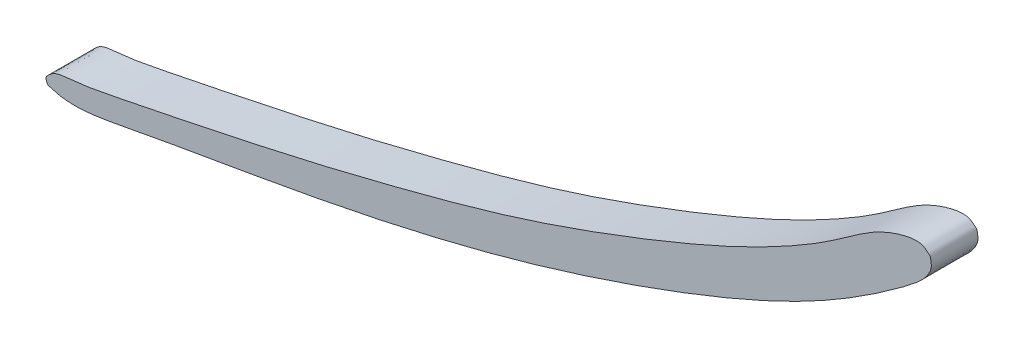
ISO-10303-21;
HEADER;
FILE_DESCRIPTION(('STEP AP214'),'2;1');
FILE_NAME('part.step','',(''),(''),'','','');
FILE_SCHEMA(('AUTOMOTIVE_DESIGN { 1 0 10303 214 1 1 1 1 }'));
ENDSEC;
DATA;
#1=APPLICATION_CONTEXT('core data for automotive mechanical design processes');
#2=APPLICATION_PROTOCOL_DEFINITION('international standard','automotive_design',2000,#1);
#3=PRODUCT_CONTEXT('',#1,'mechanical');
#4=PRODUCT('Part','Part','',(#3));
#5=PRODUCT_RELATED_PRODUCT_CATEGORY('part','',(#4));
#6=PRODUCT_DEFINITION_FORMATION('','',#4);
#7=PRODUCT_DEFINITION_CONTEXT('part definition',#1,'design');
#8=PRODUCT_DEFINITION('design','',#6,#7);
#9=PRODUCT_DEFINITION_SHAPE('','',#8);
#10=(LENGTH_UNIT() NAMED_UNIT(*) SI_UNIT(.MILLI.,.METRE.));
#11=(NAMED_UNIT(*) PLANE_ANGLE_UNIT() SI_UNIT($,.RADIAN.));
#12=(NAMED_UNIT(*) SI_UNIT($,.STERADIAN.) SOLID_ANGLE_UNIT());
#13=UNCERTAINTY_MEASURE_WITH_UNIT(LENGTH_MEASURE(1.E-05),#10,'distance_accuracy_value','');
#14=(GEOMETRIC_REPRESENTATION_CONTEXT(3) GLOBAL_UNCERTAINTY_ASSIGNED_CONTEXT((#13)) GLOBAL_UNIT_ASSIGNED_CONTEXT((#10,
#11,#12)) REPRESENTATION_CONTEXT('',''));
#15=CARTESIAN_POINT('',(0.,0.,0.));
#16=DIRECTION('',(0.,0.,1.));
#17=DIRECTION('',(1.,0.,0.));
#18=AXIS2_PLACEMENT_3D('',#15,#16,#17);
#19=CARTESIAN_POINT('',(90.3893181570191,0.,268.));
#20=CARTESIAN_POINT('',(90.3449741612423,0.095532494994125,268.));
#21=CARTESIAN_POINT('',(90.1903564309577,0.245790694884648,268.));
#22=CARTESIAN_POINT('',(89.9405943360615,0.435941672784849,268.));
#23=CARTESIAN_POINT('',(89.6951845925782,0.636693972334386,268.));
#24=CARTESIAN_POINT('',(89.4387216703739,0.820644299010657,268.));
#25=CARTESIAN_POINT('',(89.1649470762525,0.980294080954537,268.));
#26=CARTESIAN_POINT('',(88.7667192173757,1.12420436102548,268.));
#27=CARTESIAN_POINT('',(88.2408347863377,1.18949627413386,268.));
#28=CARTESIAN_POINT('',(87.608723644344,1.1691062138102,268.));
#29=CARTESIAN_POINT('',(86.9802003671491,1.09886794531898,268.));
#30=CARTESIAN_POINT('',(86.3586755890797,0.983353035462187,268.));
#31=CARTESIAN_POINT('',(85.7437171456279,0.837587611066315,268.));
#32=CARTESIAN_POINT('',(85.1343664404484,0.670082959282239,268.));
#33=CARTESIAN_POINT('',(84.5311174702158,0.481803882794702,268.));
#34=CARTESIAN_POINT('',(83.9340956746508,0.274754548220123,268.));
#35=CARTESIAN_POINT('',(83.3433244025098,0.0504855144417144,268.));
#36=CARTESIAN_POINT('',(82.7594200995892,-0.191027916262883,268.));
#37=CARTESIAN_POINT('',(82.1827365135072,-0.449332646868724,268.));
#38=CARTESIAN_POINT('',(81.614200324908,-0.725062440023513,268.));
#39=CARTESIAN_POINT('',(80.8672787095549,-1.11480141244054,268.));
#40=CARTESIAN_POINT('',(79.9549830951592,-1.64128467244249,268.));
#41=CARTESIAN_POINT('',(78.8879080755908,-2.31822422684007,268.));
#42=CARTESIAN_POINT('',(77.8414912402726,-3.02649318941564,268.));
#43=CARTESIAN_POINT('',(76.8077567521688,-3.75289115159552,268.));
#44=CARTESIAN_POINT('',(75.7786136453781,-4.48575219300204,268.));
#45=CARTESIAN_POINT('',(74.745192620238,-5.21243120349757,268.));
#46=CARTESIAN_POINT('',(73.705363162358,-5.92998691769541,268.));
#47=CARTESIAN_POINT('',(72.3071430189177,-6.869245398545,268.));
#48=CARTESIAN_POINT('',(70.5312108287513,-8.00056772699131,268.));
#49=CARTESIAN_POINT('',(68.3631687300206,-9.29785458309508,268.));
#50=CARTESIAN_POINT('',(66.1666638112714,-10.5459677731653,268.));
#51=CARTESIAN_POINT('',(63.9470326874852,-11.7521462886571,268.));
#52=CARTESIAN_POINT('',(61.7082450789077,-12.9221109172396,268.));
#53=CARTESIAN_POINT('',(59.4497540113533,-14.0533743082484,268.));
#54=CARTESIAN_POINT('',(57.1732117093506,-15.147555923275,268.));
#55=CARTESIAN_POINT('',(54.8811676784019,-16.2086355588447,268.));
#56=CARTESIAN_POINT('',(52.5758379654934,-17.2402602053796,268.));
#57=CARTESIAN_POINT('',(50.2595268678546,-18.2467700903842,268.));
#58=CARTESIAN_POINT('',(47.9340234121225,-19.23161731736,268.));
#59=CARTESIAN_POINT('',(44.8222672242958,-20.5180467173457,268.));
#60=CARTESIAN_POINT('',(40.9139844588329,-22.0801142270649,268.));
#61=CARTESIAN_POINT('',(36.1984889440622,-23.8886972769083,268.));
#62=CARTESIAN_POINT('',(31.4600336591885,-25.6357826754557,268.));
#63=CARTESIAN_POINT('',(26.6971577675447,-27.3149660429353,268.));
#64=CARTESIAN_POINT('',(21.9067452305384,-28.9138699408159,268.));
#65=CARTESIAN_POINT('',(17.0879242461507,-30.4250208800967,268.));
#66=CARTESIAN_POINT('',(12.2433592867536,-31.8514680641838,268.));
#67=CARTESIAN_POINT('',(7.37851377490247,-33.2072266679951,268.));
#68=CARTESIAN_POINT('',(2.49889883570663,-34.5091828654854,268.));
#69=CARTESIAN_POINT('',(-2.39099235554833,-35.7726575653205,268.));
#70=CARTESIAN_POINT('',(-7.28941613787878,-37.0036330418181,268.));
#71=CARTESIAN_POINT('',(-12.196990588602,-38.1988440077258,268.));
#72=CARTESIAN_POINT('',(-17.1142137640381,-39.3552737952703,268.));
#73=CARTESIAN_POINT('',(-21.2207022343462,-40.2821809608322,268.));
#74=CARTESIAN_POINT('',(-24.5099849549281,-41.0062434060181,268.));
#75=CARTESIAN_POINT('',(-26.9788682738963,-41.5410374274786,268.));
#76=CARTESIAN_POINT('',(-29.4495481771915,-42.068057471845,268.));
#77=CARTESIAN_POINT('',(-31.9218989186076,-42.5877976930578,268.));
#78=CARTESIAN_POINT('',(-34.3952599370916,-43.1033632188692,268.));
#79=CARTESIAN_POINT('',(-36.8693617728037,-43.6160571894405,268.));
#80=CARTESIAN_POINT('',(-39.3442472179342,-44.1256799714126,268.));
#81=CARTESIAN_POINT('',(-41.819883606697,-44.632401539919,268.));
#82=CARTESIAN_POINT('',(-43.8831470797298,-45.0541977878998,268.));
#83=CARTESIAN_POINT('',(-45.5341384085799,-45.3901912193429,268.));
#84=CARTESIAN_POINT('',(-46.7727250147161,-45.6407041525217,268.));
#85=CARTESIAN_POINT('',(-48.0118074805438,-45.8889748995857,268.));
#86=CARTESIAN_POINT('',(-49.2512985743143,-46.1354178627128,268.));
#87=CARTESIAN_POINT('',(-50.4911599153867,-46.3802183105027,268.));
#88=CARTESIAN_POINT('',(-51.5246083062557,-46.5832572123511,268.));
#89=CARTESIAN_POINT('',(-52.3527437588727,-46.7386938665083,268.));
#90=CARTESIAN_POINT('',(-52.9747852677357,-46.8501732803603,268.));
#91=CARTESIAN_POINT('',(-53.5980180999265,-46.9549541682327,268.));
#92=CARTESIAN_POINT('',(-54.2226088994548,-47.0513396700387,268.));
#93=CARTESIAN_POINT('',(-54.8485352623323,-47.1388193099239,268.));
#94=CARTESIAN_POINT('',(-55.4757624991505,-47.216410098303,268.));
#95=CARTESIAN_POINT('',(-56.1041759315506,-47.2841002560838,268.));
#96=CARTESIAN_POINT('',(-56.7337834105256,-47.3393740035283,268.));
#97=CARTESIAN_POINT('',(-57.3636077486203,-47.3923177682917,268.));
#98=CARTESIAN_POINT('',(-57.9921371875076,-47.459535681437,268.));
#99=CARTESIAN_POINT('',(-58.617459931412,-47.5531750411075,268.));
#100=CARTESIAN_POINT('',(-59.1323214178197,-47.6665361646427,268.));
#101=CARTESIAN_POINT('',(-59.533911254146,-47.7959840558897,268.));
#102=CARTESIAN_POINT('',(-59.8259782101639,-47.9170972552867,268.));
#103=CARTESIAN_POINT('',(-60.1049439929597,-48.0668856428846,268.));
#104=CARTESIAN_POINT('',(-60.364306841939,-48.2484398600975,268.));
#105=CARTESIAN_POINT('',(-60.6080319935694,-48.4493493412946,268.));
#106=CARTESIAN_POINT('',(-60.8377098136074,-48.6678246256958,268.));
#107=CARTESIAN_POINT('',(-61.0636551247925,-48.8862166783374,268.));
#108=CARTESIAN_POINT('',(-61.1938215215347,-49.0584119130356,268.));
#109=CARTESIAN_POINT('',(-61.2419943616398,-49.2207126076058,268.));
#110=CARTESIAN_POINT('',(-61.2507595327435,-49.3504814375911,268.));
#111=CARTESIAN_POINT('',(-61.2144418375225,-49.539132710305,268.));
#112=CARTESIAN_POINT('',(-61.1598348326393,-49.7234082321822,268.));
#113=CARTESIAN_POINT('',(-61.093082378302,-49.9030009171411,268.));
#114=CARTESIAN_POINT('',(-60.999537939376,-50.0725001877869,268.));
#115=CARTESIAN_POINT('',(-60.8547836775959,-50.2035916471443,268.));
#116=CARTESIAN_POINT('',(-60.6721638964919,-50.2704189447769,268.));
#117=CARTESIAN_POINT('',(-60.4856304793058,-50.3120302155312,268.));
#118=CARTESIAN_POINT('',(-60.2979803225231,-50.3535951936377,268.));
#119=CARTESIAN_POINT('',(-60.0504246501731,-50.4174788984263,268.));
#120=CARTESIAN_POINT('',(-59.742620398469,-50.50440759381,268.));
#121=CARTESIAN_POINT('',(-59.3739519165278,-50.6106906092224,268.));
#122=CARTESIAN_POINT('',(-59.0010570021076,-50.7018436693387,268.));
#123=CARTESIAN_POINT('',(-58.6237267382278,-50.7722969621957,268.));
#124=CARTESIAN_POINT('',(-58.243835610727,-50.8269085471101,268.));
#125=CARTESIAN_POINT('',(-57.862187922574,-50.867596039482,268.));
#126=CARTESIAN_POINT('',(-57.4795543729846,-50.8972190040287,268.));
#127=CARTESIAN_POINT('',(-57.096336551515,-50.9181761426262,268.));
#128=CARTESIAN_POINT('',(-56.7127721849629,-50.9313493555014,268.));
#129=CARTESIAN_POINT('',(-56.329005568683,-50.936708477107,268.));
#130=CARTESIAN_POINT('',(-55.9452032521428,-50.9345749716004,268.));
#131=CARTESIAN_POINT('',(-55.5615018146098,-50.9251844563151,268.));
#132=CARTESIAN_POINT('',(-55.0501976145661,-50.9033474618915,268.));
#133=CARTESIAN_POINT('',(-54.4119316042755,-50.8592575920939,268.));
#134=CARTESIAN_POINT('',(-53.6478860849468,-50.7839610419192,268.));
#135=CARTESIAN_POINT('',(-52.8858249955221,-50.6906495298872,268.));
#136=CARTESIAN_POINT('',(-52.1255119002948,-50.5839156868908,268.));
#137=CARTESIAN_POINT('',(-51.366652995808,-50.4671311707637,268.));
#138=CARTESIAN_POINT('',(-50.6091057440555,-50.3419420460893,268.));
#139=CARTESIAN_POINT('',(-49.8526064019016,-50.2104127241271,268.));
#140=CARTESIAN_POINT('',(-49.0968565454264,-50.0744791199165,268.));
#141=CARTESIAN_POINT('',(-48.3415544064759,-49.9359082440822,268.));
#142=CARTESIAN_POINT('',(-47.5866088853657,-49.795248544097,268.));
#143=CARTESIAN_POINT('',(-46.580290112188,-49.6060059394261,268.));
#144=CARTESIAN_POINT('',(-45.3225323070613,-49.3683134768694,268.));
#145=CARTESIAN_POINT('',(-43.8125243053064,-49.0861706501287,268.));
#146=CARTESIAN_POINT('',(-42.301823868569,-48.8071462831319,268.));
#147=CARTESIAN_POINT('',(-40.7902307810726,-48.5323853469724,268.));
#148=CARTESIAN_POINT('',(-39.2778166321588,-48.2615919187462,268.));
#149=CARTESIAN_POINT('',(-37.2603213364181,-47.9050626472468,268.));
#150=CARTESIAN_POINT('',(-34.7371202014104,-47.4656077685439,268.));
#151=CARTESIAN_POINT('',(-31.7079197640359,-46.9440036546648,268.));
#152=CARTESIAN_POINT('',(-28.6784720531132,-46.4219232720013,268.));
#153=CARTESIAN_POINT('',(-25.6494973233373,-45.8953769148422,268.));
#154=CARTESIAN_POINT('',(-22.6217158175266,-45.3603748919555,268.));
#155=CARTESIAN_POINT('',(-19.5956835026523,-44.8142599576629,268.));
#156=CARTESIAN_POINT('',(-16.5719563452682,-44.2543748696664,268.));
#157=CARTESIAN_POINT('',(-13.5509097085504,-43.6792524857762,268.));
#158=CARTESIAN_POINT('',(-10.532918955579,-43.0874256652819,268.));
#159=CARTESIAN_POINT('',(-7.51839583441635,-42.477613769529,268.));
#160=CARTESIAN_POINT('',(-4.50775209670752,-41.8485361225504,268.));
#161=CARTESIAN_POINT('',(-0.499182991426727,-40.9829292380272,268.));
#162=CARTESIAN_POINT('',(4.50014230220984,-39.8484474034174,268.));
#163=CARTESIAN_POINT('',(10.477026578799,-38.3929130562989,268.));
#164=CARTESIAN_POINT('',(16.4289741195897,-36.8397102025609,268.));
#165=CARTESIAN_POINT('',(22.3507608035447,-35.1772364412315,268.));
#166=CARTESIAN_POINT('',(28.2391377720439,-33.4032291656442,268.));
#167=CARTESIAN_POINT('',(32.1414874516204,-32.1481538009184,268.));
#168=CARTESIAN_POINT('',(35.3987413368636,-31.0678022392212,268.));
#169=CARTESIAN_POINT('',(38.017927450495,-30.1813347872321,268.));
#170=CARTESIAN_POINT('',(41.9311881759202,-28.804490310831,268.));
#171=CARTESIAN_POINT('',(45.8281291609075,-27.3806880848635,268.));
#172=CARTESIAN_POINT('',(49.7067679246719,-25.9067881785557,268.));
#173=CARTESIAN_POINT('',(53.5643763836165,-24.3781816480184,268.));
#174=CARTESIAN_POINT('',(57.3970870456508,-22.7880545039109,268.));
#175=CARTESIAN_POINT('',(60.5649097963154,-21.4018484692677,268.));
#176=CARTESIAN_POINT('',(63.0794912722467,-20.2495825487365,268.));
#177=CARTESIAN_POINT('',(64.9543810042245,-19.3619043433722,268.));
#178=CARTESIAN_POINT('',(66.8169734365983,-18.4489392965895,268.));
#179=CARTESIAN_POINT('',(68.6658338917919,-17.5087734734508,268.));
#180=CARTESIAN_POINT('',(70.4998111704287,-16.5402080970252,268.));
#181=CARTESIAN_POINT('',(72.3175653947791,-15.5418947666822,268.));
#182=CARTESIAN_POINT('',(74.1180835249587,-14.5131992295929,268.));
#183=CARTESIAN_POINT('',(75.9001740822143,-13.4533274672683,268.));
#184=CARTESIAN_POINT('',(77.6634132661252,-12.3628212679054,268.));
#185=CARTESIAN_POINT('',(79.4075681502796,-11.242552586073,268.));
#186=CARTESIAN_POINT('',(81.1330236381052,-10.0941748282077,268.));
#187=CARTESIAN_POINT('',(82.5549812862226,-9.11415311622516,268.));
#188=CARTESIAN_POINT('',(83.6846454660794,-8.31912075198982,268.));
#189=CARTESIAN_POINT('',(84.5275984895049,-7.71693063197795,268.));
#190=CARTESIAN_POINT('',(85.3659122571856,-7.10841631339921,268.));
#191=CARTESIAN_POINT('',(86.1975610533912,-6.49099736125044,268.));
#192=CARTESIAN_POINT('',(86.8833589252887,-5.96690992426684,268.));
#193=CARTESIAN_POINT('',(87.4231988901658,-5.53645658358077,268.));
#194=CARTESIAN_POINT('',(87.8226020860301,-5.20692267937711,268.));
#195=CARTESIAN_POINT('',(88.2154508983264,-4.86959267857574,268.));
#196=CARTESIAN_POINT('',(88.5990685104187,-4.52179847260577,268.));
#197=CARTESIAN_POINT('',(88.9693287926501,-4.15978528562518,268.));
#198=CARTESIAN_POINT('',(89.3221666694029,-3.78068714941963,268.));
#199=CARTESIAN_POINT('',(89.6523799938622,-3.38171222628572,268.));
#200=CARTESIAN_POINT('',(89.9523557935328,-2.95919081488107,268.));
#201=CARTESIAN_POINT('',(90.212333730247,-2.51102429841182,268.));
#202=CARTESIAN_POINT('',(90.4272426878479,-2.03912829809428,268.));
#203=CARTESIAN_POINT('',(90.5442947457863,-1.62203694399719,268.));
#204=CARTESIAN_POINT('',(90.577661025838,-1.27743731600624,268.));
#205=CARTESIAN_POINT('',(90.5613932390312,-1.01851585251253,268.));
#206=CARTESIAN_POINT('',(90.5210852184666,-0.763126986990301,268.));
#207=CARTESIAN_POINT('',(90.4741935099733,-0.507955367680359,268.));
#208=CARTESIAN_POINT('',(90.4493178854206,-0.251456427520445,268.));
#209=CARTESIAN_POINT('',(90.4256325875517,-0.0782339997173593,268.));
#210=CARTESIAN_POINT('',(90.3893181570191,0.,268.));
#211=B_SPLINE_CURVE_WITH_KNOTS('',3,(#19,#20,#21,#22,#23,#24,#25,#26,#27,#28,#29,#30,#31,#32,
#33,#34,#35,#36,#37,#38,#39,#40,#41,#42,#43,#44,#45,#46,#47,#48,#49,#50,#51,#52,#53,#54,#55,#56,
#57,#58,#59,#60,#61,#62,#63,#64,#65,#66,#67,#68,#69,#70,#71,#72,#73,#74,#75,#76,#77,#78,#79,#80,
#81,#82,#83,#84,#85,#86,#87,#88,#89,#90,#91,#92,#93,#94,#95,#96,#97,#98,#99,#100,#101,#102,#103,
#104,#105,#106,#107,#108,#109,#110,#111,#112,#113,#114,#115,#116,#117,#118,#119,#120,#121,#122,
#123,#124,#125,#126,#127,#128,#129,#130,#131,#132,#133,#134,#135,#136,#137,#138,#139,#140,#141,
#142,#143,#144,#145,#146,#147,#148,#149,#150,#151,#152,#153,#154,#155,#156,#157,#158,#159,#160,
#161,#162,#163,#164,#165,#166,#167,#168,#169,#170,#171,#172,#173,#174,#175,#176,#177,#178,#179,
#180,#181,#182,#183,#184,#185,#186,#187,#188,#189,#190,#191,#192,#193,#194,#195,#196,#197,#198,
#199,#200,#201,#202,#203,#204,#205,#206,#207,#208,#209,#210),.UNSPECIFIED.,.T.,.F.,(4,1,1,1,1,1,
1,1,1,1,1,1,1,1,1,1,1,1,1,1,1,1,1,1,1,1,1,1,1,1,1,1,1,1,1,1,1,1,1,1,1,1,1,1,1,1,1,1,1,1,1,1,1,1,
1,1,1,1,1,1,1,1,1,1,1,1,1,1,1,1,1,1,1,1,1,1,1,1,1,1,1,1,1,1,1,1,1,1,2,1,1,1,1,1,1,1,1,1,1,1,1,1,
1,1,1,1,1,1,1,1,1,1,1,1,1,1,1,1,1,1,1,1,1,1,1,1,1,1,1,1,1,1,1,1,1,1,1,1,1,1,1,1,1,1,1,1,2,1,1,1,
1,1,1,1,1,1,1,1,1,1,1,1,1,1,1,1,1,1,1,1,1,1,1,1,1,1,1,1,1,1,1,1,1,1,1,1,1,4),(0.,
0.000968610491071331,0.00193722098214277,0.00290583147321422,0.00387444196428566,
0.00484305245535721,0.00581166294642843,0.00774888392857143,0.00968610491071431,
0.0116233258928572,0.013560546875,0.015497767857143,0.0174349888392857,0.0193722098214285,
0.0213094308035715,0.0232466517857144,0.0251838727678572,0.02712109375,0.0290583147321429,
0.0309955357142857,0.0348699776785716,0.0387444196428571,0.0426188616071429,0.0464933035714286,
0.0503677455357143,0.0542421875000001,0.0581166294642856,0.0619910714285714,0.0697399553571428,
0.0774888392857144,0.0852377232142858,0.0929866071428572,0.100735491071429,0.108484375,
0.116233258928572,0.123982142857143,0.131731026785714,0.139479910714286,0.147228794642857,
0.154977678571429,0.170475446428571,0.185973214285714,0.201470982142857,0.21696875,
0.232466517857143,0.247964285714286,0.263462053571429,0.278959821428572,0.294457589285714,
0.309955357142857,0.325453125,0.340950892857143,0.356448660714286,0.371946428571429,
0.3796953125,0.387444196428572,0.395193080357143,0.402941964285714,0.410690848214286,
0.418439732142857,0.426188616071429,0.4339375,0.441686383928572,0.445560825892857,
0.449435267857143,0.453309709821429,0.457184151785715,0.46105859375,0.464933035714286,
0.466870256696429,0.468807477678572,0.470744698660715,0.472681919642857,0.474619140625,
0.476556361607143,0.478493582589286,0.480430803571429,0.482368024553572,0.484305245535714,
0.486242466517858,0.4881796875,0.489148297991072,0.490116908482143,0.491085518973215,
0.492054129464286,0.493022739955357,0.493991350446429,0.4949599609375,0.495928571428572,
0.496516476004465,0.497104380580357,0.49769228515625,0.498280189732143,0.498868094308036,
0.499455998883929,0.500043903459822,0.500631808035714,0.501219712611607,0.5018076171875,
0.502983426339286,0.504159235491072,0.505335044642857,0.506510853794643,0.507686662946429,
0.508862472098214,0.51003828125,0.511214090401786,0.512389899553572,0.513565708705357,
0.514741517857143,0.515917327008929,0.517093136160715,0.519444754464286,0.521796372767857,
0.524147991071429,0.526499609375,0.528851227678572,0.531202845982143,0.533554464285714,
0.535906082589286,0.538257700892857,0.540609319196429,0.5429609375,0.547664174107143,
0.552367410714286,0.557070647321429,0.561773883928572,0.566477120535714,0.571180357142857,
0.580586830357143,0.589993303571429,0.599399776785714,0.60880625,0.618212723214286,
0.627619196428572,0.637025669642857,0.646432142857143,0.655838616071429,0.665245089285714,
0.6746515625,0.684058035714286,0.702870982142857,0.721683928571429,0.740496875,
0.759309821428572,0.778122767857143,0.796935714285714,0.809627232142857,0.82231875,
0.835010267857143,0.847701785714286,0.860393303571429,0.873084821428571,0.885776339285714,
0.892122098214286,0.898467857142857,0.904813616071429,0.911159375,0.917505133928571,
0.923850892857143,0.930196651785714,0.936542410714286,0.942888169642857,0.949233928571429,
0.9555796875,0.961925446428571,0.965098325892857,0.968271205357143,0.971444084821429,
0.974616964285714,0.97778984375,0.979376283482143,0.980962723214286,0.982549162946429,
0.984135602678571,0.985722042410714,0.987308482142857,0.988894921875,0.990481361607143,
0.992067801339286,0.993654241071429,0.995240680803571,0.996033900669643,0.996827120535714,
0.997620340401786,0.998413560267857,0.999206780133929,1.),.UNSPECIFIED.);
#212=DIRECTION('',(0.,0.,-1.));
#213=VECTOR('',#212,1.);
#214=SURFACE_OF_LINEAR_EXTRUSION('',#211,#213);
#215=CARTESIAN_POINT('',(90.3893181570191,0.,268.));
#216=VERTEX_POINT('',#215);
#217=EDGE_CURVE('E10',#216,#216,#211,.T.);
#218=ORIENTED_EDGE('',*,*,#217,.F.);
#219=EDGE_LOOP('',(#218));
#220=FACE_BOUND('',#219,.T.);
#221=CARTESIAN_POINT('',(90.3893181570191,0.,260.));
#222=CARTESIAN_POINT('',(90.3449741612423,0.095532494994125,260.));
#223=CARTESIAN_POINT('',(90.1903564309577,0.245790694884648,260.));
#224=CARTESIAN_POINT('',(89.9405943360615,0.435941672784849,260.));
#225=CARTESIAN_POINT('',(89.6951845925782,0.636693972334386,260.));
#226=CARTESIAN_POINT('',(89.4387216703739,0.820644299010657,260.));
#227=CARTESIAN_POINT('',(89.1649470762525,0.980294080954537,260.));
#228=CARTESIAN_POINT('',(88.7667192173757,1.12420436102548,260.));
#229=CARTESIAN_POINT('',(88.2408347863377,1.18949627413386,260.));
#230=CARTESIAN_POINT('',(87.608723644344,1.1691062138102,260.));
#231=CARTESIAN_POINT('',(86.9802003671491,1.09886794531898,260.));
#232=CARTESIAN_POINT('',(86.3586755890797,0.983353035462187,260.));
#233=CARTESIAN_POINT('',(85.7437171456279,0.837587611066315,260.));
#234=CARTESIAN_POINT('',(85.1343664404484,0.670082959282239,260.));
#235=CARTESIAN_POINT('',(84.5311174702158,0.481803882794702,260.));
#236=CARTESIAN_POINT('',(83.9340956746508,0.274754548220123,260.));
#237=CARTESIAN_POINT('',(83.3433244025098,0.0504855144417144,260.));
#238=CARTESIAN_POINT('',(82.7594200995892,-0.191027916262883,260.));
#239=CARTESIAN_POINT('',(82.1827365135072,-0.449332646868724,260.));
#240=CARTESIAN_POINT('',(81.614200324908,-0.725062440023513,260.));
#241=CARTESIAN_POINT('',(80.8672787095549,-1.11480141244054,260.));
#242=CARTESIAN_POINT('',(79.9549830951592,-1.64128467244249,260.));
#243=CARTESIAN_POINT('',(78.8879080755908,-2.31822422684007,260.));
#244=CARTESIAN_POINT('',(77.8414912402726,-3.02649318941564,260.));
#245=CARTESIAN_POINT('',(76.8077567521688,-3.75289115159552,260.));
#246=CARTESIAN_POINT('',(75.7786136453781,-4.48575219300204,260.));
#247=CARTESIAN_POINT('',(74.745192620238,-5.21243120349757,260.));
#248=CARTESIAN_POINT('',(73.705363162358,-5.92998691769541,260.));
#249=CARTESIAN_POINT('',(72.3071430189177,-6.869245398545,260.));
#250=CARTESIAN_POINT('',(70.5312108287513,-8.00056772699131,260.));
#251=CARTESIAN_POINT('',(68.3631687300206,-9.29785458309508,260.));
#252=CARTESIAN_POINT('',(66.1666638112714,-10.5459677731653,260.));
#253=CARTESIAN_POINT('',(63.9470326874852,-11.7521462886571,260.));
#254=CARTESIAN_POINT('',(61.7082450789077,-12.9221109172396,260.));
#255=CARTESIAN_POINT('',(59.4497540113533,-14.0533743082484,260.));
#256=CARTESIAN_POINT('',(57.1732117093506,-15.147555923275,260.));
#257=CARTESIAN_POINT('',(54.8811676784019,-16.2086355588447,260.));
#258=CARTESIAN_POINT('',(52.5758379654934,-17.2402602053796,260.));
#259=CARTESIAN_POINT('',(50.2595268678546,-18.2467700903842,260.));
#260=CARTESIAN_POINT('',(47.9340234121225,-19.23161731736,260.));
#261=CARTESIAN_POINT('',(44.8222672242958,-20.5180467173457,260.));
#262=CARTESIAN_POINT('',(40.9139844588329,-22.0801142270649,260.));
#263=CARTESIAN_POINT('',(36.1984889440622,-23.8886972769083,260.));
#264=CARTESIAN_POINT('',(31.4600336591885,-25.6357826754557,260.));
#265=CARTESIAN_POINT('',(26.6971577675447,-27.3149660429353,260.));
#266=CARTESIAN_POINT('',(21.9067452305384,-28.9138699408159,260.));
#267=CARTESIAN_POINT('',(17.0879242461507,-30.4250208800967,260.));
#268=CARTESIAN_POINT('',(12.2433592867536,-31.8514680641838,260.));
#269=CARTESIAN_POINT('',(7.37851377490247,-33.2072266679951,260.));
#270=CARTESIAN_POINT('',(2.49889883570663,-34.5091828654854,260.));
#271=CARTESIAN_POINT('',(-2.39099235554833,-35.7726575653205,260.));
#272=CARTESIAN_POINT('',(-7.28941613787878,-37.0036330418181,260.));
#273=CARTESIAN_POINT('',(-12.196990588602,-38.1988440077258,260.));
#274=CARTESIAN_POINT('',(-17.1142137640381,-39.3552737952703,260.));
#275=CARTESIAN_POINT('',(-21.2207022343462,-40.2821809608322,260.));
#276=CARTESIAN_POINT('',(-24.5099849549281,-41.0062434060181,260.));
#277=CARTESIAN_POINT('',(-26.9788682738963,-41.5410374274786,260.));
#278=CARTESIAN_POINT('',(-29.4495481771915,-42.068057471845,260.));
#279=CARTESIAN_POINT('',(-31.9218989186076,-42.5877976930578,260.));
#280=CARTESIAN_POINT('',(-34.3952599370916,-43.1033632188692,260.));
#281=CARTESIAN_POINT('',(-36.8693617728037,-43.6160571894405,260.));
#282=CARTESIAN_POINT('',(-39.3442472179342,-44.1256799714126,260.));
#283=CARTESIAN_POINT('',(-41.819883606697,-44.632401539919,260.));
#284=CARTESIAN_POINT('',(-43.8831470797298,-45.0541977878998,260.));
#285=CARTESIAN_POINT('',(-45.5341384085799,-45.3901912193429,260.));
#286=CARTESIAN_POINT('',(-46.7727250147161,-45.6407041525217,260.));
#287=CARTESIAN_POINT('',(-48.0118074805438,-45.8889748995857,260.));
#288=CARTESIAN_POINT('',(-49.2512985743143,-46.1354178627128,260.));
#289=CARTESIAN_POINT('',(-50.4911599153867,-46.3802183105027,260.));
#290=CARTESIAN_POINT('',(-51.5246083062557,-46.5832572123511,260.));
#291=CARTESIAN_POINT('',(-52.3527437588727,-46.7386938665083,260.));
#292=CARTESIAN_POINT('',(-52.9747852677357,-46.8501732803603,260.));
#293=CARTESIAN_POINT('',(-53.5980180999265,-46.9549541682327,260.));
#294=CARTESIAN_POINT('',(-54.2226088994548,-47.0513396700387,260.));
#295=CARTESIAN_POINT('',(-54.8485352623323,-47.1388193099239,260.));
#296=CARTESIAN_POINT('',(-55.4757624991505,-47.216410098303,260.));
#297=CARTESIAN_POINT('',(-56.1041759315506,-47.2841002560838,260.));
#298=CARTESIAN_POINT('',(-56.7337834105256,-47.3393740035283,260.));
#299=CARTESIAN_POINT('',(-57.3636077486203,-47.3923177682917,260.));
#300=CARTESIAN_POINT('',(-57.9921371875076,-47.459535681437,260.));
#301=CARTESIAN_POINT('',(-58.617459931412,-47.5531750411075,260.));
#302=CARTESIAN_POINT('',(-59.1323214178197,-47.6665361646427,260.));
#303=CARTESIAN_POINT('',(-59.533911254146,-47.7959840558897,260.));
#304=CARTESIAN_POINT('',(-59.8259782101639,-47.9170972552867,260.));
#305=CARTESIAN_POINT('',(-60.1049439929597,-48.0668856428846,260.));
#306=CARTESIAN_POINT('',(-60.364306841939,-48.2484398600975,260.));
#307=CARTESIAN_POINT('',(-60.6080319935694,-48.4493493412946,260.));
#308=CARTESIAN_POINT('',(-60.8377098136074,-48.6678246256958,260.));
#309=CARTESIAN_POINT('',(-61.0636551247925,-48.8862166783374,260.));
#310=CARTESIAN_POINT('',(-61.1938215215347,-49.0584119130356,260.));
#311=CARTESIAN_POINT('',(-61.2419943616398,-49.2207126076058,260.));
#312=CARTESIAN_POINT('',(-61.2507595327435,-49.3504814375911,260.));
#313=CARTESIAN_POINT('',(-61.2144418375225,-49.539132710305,260.));
#314=CARTESIAN_POINT('',(-61.1598348326393,-49.7234082321822,260.));
#315=CARTESIAN_POINT('',(-61.093082378302,-49.9030009171411,260.));
#316=CARTESIAN_POINT('',(-60.999537939376,-50.0725001877869,260.));
#317=CARTESIAN_POINT('',(-60.8547836775959,-50.2035916471443,260.));
#318=CARTESIAN_POINT('',(-60.6721638964919,-50.2704189447769,260.));
#319=CARTESIAN_POINT('',(-60.4856304793058,-50.3120302155312,260.));
#320=CARTESIAN_POINT('',(-60.2979803225231,-50.3535951936377,260.));
#321=CARTESIAN_POINT('',(-60.0504246501731,-50.4174788984263,260.));
#322=CARTESIAN_POINT('',(-59.742620398469,-50.50440759381,260.));
#323=CARTESIAN_POINT('',(-59.3739519165278,-50.6106906092224,260.));
#324=CARTESIAN_POINT('',(-59.0010570021076,-50.7018436693387,260.));
#325=CARTESIAN_POINT('',(-58.6237267382278,-50.7722969621957,260.));
#326=CARTESIAN_POINT('',(-58.243835610727,-50.8269085471101,260.));
#327=CARTESIAN_POINT('',(-57.862187922574,-50.867596039482,260.));
#328=CARTESIAN_POINT('',(-57.4795543729846,-50.8972190040287,260.));
#329=CARTESIAN_POINT('',(-57.096336551515,-50.9181761426262,260.));
#330=CARTESIAN_POINT('',(-56.7127721849629,-50.9313493555014,260.));
#331=CARTESIAN_POINT('',(-56.329005568683,-50.936708477107,260.));
#332=CARTESIAN_POINT('',(-55.9452032521428,-50.9345749716004,260.));
#333=CARTESIAN_POINT('',(-55.5615018146098,-50.9251844563151,260.));
#334=CARTESIAN_POINT('',(-55.0501976145661,-50.9033474618915,260.));
#335=CARTESIAN_POINT('',(-54.4119316042755,-50.8592575920939,260.));
#336=CARTESIAN_POINT('',(-53.6478860849468,-50.7839610419192,260.));
#337=CARTESIAN_POINT('',(-52.8858249955221,-50.6906495298872,260.));
#338=CARTESIAN_POINT('',(-52.1255119002948,-50.5839156868908,260.));
#339=CARTESIAN_POINT('',(-51.366652995808,-50.4671311707637,260.));
#340=CARTESIAN_POINT('',(-50.6091057440555,-50.3419420460893,260.));
#341=CARTESIAN_POINT('',(-49.8526064019016,-50.2104127241271,260.));
#342=CARTESIAN_POINT('',(-49.0968565454264,-50.0744791199165,260.));
#343=CARTESIAN_POINT('',(-48.3415544064759,-49.9359082440822,260.));
#344=CARTESIAN_POINT('',(-47.5866088853657,-49.795248544097,260.));
#345=CARTESIAN_POINT('',(-46.580290112188,-49.6060059394261,260.));
#346=CARTESIAN_POINT('',(-45.3225323070613,-49.3683134768694,260.));
#347=CARTESIAN_POINT('',(-43.8125243053064,-49.0861706501287,260.));
#348=CARTESIAN_POINT('',(-42.301823868569,-48.8071462831319,260.));
#349=CARTESIAN_POINT('',(-40.7902307810726,-48.5323853469724,260.));
#350=CARTESIAN_POINT('',(-39.2778166321588,-48.2615919187462,260.));
#351=CARTESIAN_POINT('',(-37.2603213364181,-47.9050626472468,260.));
#352=CARTESIAN_POINT('',(-34.7371202014104,-47.4656077685439,260.));
#353=CARTESIAN_POINT('',(-31.7079197640359,-46.9440036546648,260.));
#354=CARTESIAN_POINT('',(-28.6784720531132,-46.4219232720013,260.));
#355=CARTESIAN_POINT('',(-25.6494973233373,-45.8953769148422,260.));
#356=CARTESIAN_POINT('',(-22.6217158175266,-45.3603748919555,260.));
#357=CARTESIAN_POINT('',(-19.5956835026523,-44.8142599576629,260.));
#358=CARTESIAN_POINT('',(-16.5719563452682,-44.2543748696664,260.));
#359=CARTESIAN_POINT('',(-13.5509097085504,-43.6792524857762,260.));
#360=CARTESIAN_POINT('',(-10.532918955579,-43.0874256652819,260.));
#361=CARTESIAN_POINT('',(-7.51839583441635,-42.477613769529,260.));
#362=CARTESIAN_POINT('',(-4.50775209670752,-41.8485361225504,260.));
#363=CARTESIAN_POINT('',(-0.499182991426727,-40.9829292380272,260.));
#364=CARTESIAN_POINT('',(4.50014230220984,-39.8484474034174,260.));
#365=CARTESIAN_POINT('',(10.477026578799,-38.3929130562989,260.));
#366=CARTESIAN_POINT('',(16.4289741195897,-36.8397102025609,260.));
#367=CARTESIAN_POINT('',(22.3507608035447,-35.1772364412315,260.));
#368=CARTESIAN_POINT('',(28.2391377720439,-33.4032291656442,260.));
#369=CARTESIAN_POINT('',(32.1414874516204,-32.1481538009184,260.));
#370=CARTESIAN_POINT('',(35.3987413368636,-31.0678022392212,260.));
#371=CARTESIAN_POINT('',(38.017927450495,-30.1813347872321,260.));
#372=CARTESIAN_POINT('',(41.9311881759202,-28.804490310831,260.));
#373=CARTESIAN_POINT('',(45.8281291609075,-27.3806880848635,260.));
#374=CARTESIAN_POINT('',(49.7067679246719,-25.9067881785557,260.));
#375=CARTESIAN_POINT('',(53.5643763836165,-24.3781816480184,260.));
#376=CARTESIAN_POINT('',(57.3970870456508,-22.7880545039109,260.));
#377=CARTESIAN_POINT('',(60.5649097963154,-21.4018484692677,260.));
#378=CARTESIAN_POINT('',(63.0794912722467,-20.2495825487365,260.));
#379=CARTESIAN_POINT('',(64.9543810042245,-19.3619043433722,260.));
#380=CARTESIAN_POINT('',(66.8169734365983,-18.4489392965895,260.));
#381=CARTESIAN_POINT('',(68.6658338917919,-17.5087734734508,260.));
#382=CARTESIAN_POINT('',(70.4998111704287,-16.5402080970252,260.));
#383=CARTESIAN_POINT('',(72.3175653947791,-15.5418947666822,260.));
#384=CARTESIAN_POINT('',(74.1180835249587,-14.5131992295929,260.));
#385=CARTESIAN_POINT('',(75.9001740822143,-13.4533274672683,260.));
#386=CARTESIAN_POINT('',(77.6634132661252,-12.3628212679054,260.));
#387=CARTESIAN_POINT('',(79.4075681502796,-11.242552586073,260.));
#388=CARTESIAN_POINT('',(81.1330236381052,-10.0941748282077,260.));
#389=CARTESIAN_POINT('',(82.5549812862226,-9.11415311622516,260.));
#390=CARTESIAN_POINT('',(83.6846454660794,-8.31912075198982,260.));
#391=CARTESIAN_POINT('',(84.5275984895049,-7.71693063197795,260.));
#392=CARTESIAN_POINT('',(85.3659122571856,-7.10841631339921,260.));
#393=CARTESIAN_POINT('',(86.1975610533912,-6.49099736125044,260.));
#394=CARTESIAN_POINT('',(86.8833589252887,-5.96690992426684,260.));
#395=CARTESIAN_POINT('',(87.4231988901658,-5.53645658358077,260.));
#396=CARTESIAN_POINT('',(87.8226020860301,-5.20692267937711,260.));
#397=CARTESIAN_POINT('',(88.2154508983264,-4.86959267857574,260.));
#398=CARTESIAN_POINT('',(88.5990685104187,-4.52179847260577,260.));
#399=CARTESIAN_POINT('',(88.9693287926501,-4.15978528562518,260.));
#400=CARTESIAN_POINT('',(89.3221666694029,-3.78068714941963,260.));
#401=CARTESIAN_POINT('',(89.6523799938622,-3.38171222628572,260.));
#402=CARTESIAN_POINT('',(89.9523557935328,-2.95919081488107,260.));
#403=CARTESIAN_POINT('',(90.212333730247,-2.51102429841182,260.));
#404=CARTESIAN_POINT('',(90.4272426878479,-2.03912829809428,260.));
#405=CARTESIAN_POINT('',(90.5442947457863,-1.62203694399719,260.));
#406=CARTESIAN_POINT('',(90.577661025838,-1.27743731600624,260.));
#407=CARTESIAN_POINT('',(90.5613932390312,-1.01851585251253,260.));
#408=CARTESIAN_POINT('',(90.5210852184666,-0.763126986990301,260.));
#409=CARTESIAN_POINT('',(90.4741935099733,-0.507955367680359,260.));
#410=CARTESIAN_POINT('',(90.4493178854206,-0.251456427520445,260.));
#411=CARTESIAN_POINT('',(90.4256325875517,-0.0782339997173593,260.));
#412=CARTESIAN_POINT('',(90.3893181570191,0.,260.));
#413=B_SPLINE_CURVE_WITH_KNOTS('',3,(#221,#222,#223,#224,#225,#226,#227,#228,#229,#230,#231,
#232,#233,#234,#235,#236,#237,#238,#239,#240,#241,#242,#243,#244,#245,#246,#247,#248,#249,#250,
#251,#252,#253,#254,#255,#256,#257,#258,#259,#260,#261,#262,#263,#264,#265,#266,#267,#268,#269,
#270,#271,#272,#273,#274,#275,#276,#277,#278,#279,#280,#281,#282,#283,#284,#285,#286,#287,#288,
#289,#290,#291,#292,#293,#294,#295,#296,#297,#298,#299,#300,#301,#302,#303,#304,#305,#306,#307,
#308,#309,#310,#311,#312,#313,#314,#315,#316,#317,#318,#319,#320,#321,#322,#323,#324,#325,#326,
#327,#328,#329,#330,#331,#332,#333,#334,#335,#336,#337,#338,#339,#340,#341,#342,#343,#344,#345,
#346,#347,#348,#349,#350,#351,#352,#353,#354,#355,#356,#357,#358,#359,#360,#361,#362,#363,#364,
#365,#366,#367,#368,#369,#370,#371,#372,#373,#374,#375,#376,#377,#378,#379,#380,#381,#382,#383,
#384,#385,#386,#387,#388,#389,#390,#391,#392,#393,#394,#395,#396,#397,#398,#399,#400,#401,#402,
#403,#404,#405,#406,#407,#408,#409,#410,#411,#412),.UNSPECIFIED.,.T.,.F.,(4,1,1,1,1,1,1,1,1,1,1,
1,1,1,1,1,1,1,1,1,1,1,1,1,1,1,1,1,1,1,1,1,1,1,1,1,1,1,1,1,1,1,1,1,1,1,1,1,1,1,1,1,1,1,1,1,1,1,1,
1,1,1,1,1,1,1,1,1,1,1,1,1,1,1,1,1,1,1,1,1,1,1,1,1,1,1,1,1,2,1,1,1,1,1,1,1,1,1,1,1,1,1,1,1,1,1,1,
1,1,1,1,1,1,1,1,1,1,1,1,1,1,1,1,1,1,1,1,1,1,1,1,1,1,1,1,1,1,1,1,1,1,1,1,1,1,1,2,1,1,1,1,1,1,1,1,
1,1,1,1,1,1,1,1,1,1,1,1,1,1,1,1,1,1,1,1,1,1,1,1,1,1,1,1,1,1,1,1,4),(0.,0.000968610491071331,
0.00193722098214277,0.00290583147321422,0.00387444196428566,0.00484305245535721,
0.00581166294642843,0.00774888392857143,0.00968610491071431,0.0116233258928572,0.013560546875,
0.015497767857143,0.0174349888392857,0.0193722098214285,0.0213094308035715,0.0232466517857144,
0.0251838727678572,0.02712109375,0.0290583147321429,0.0309955357142857,0.0348699776785716,
0.0387444196428571,0.0426188616071429,0.0464933035714286,0.0503677455357143,0.0542421875000001,
0.0581166294642856,0.0619910714285714,0.0697399553571428,0.0774888392857144,0.0852377232142858,
0.0929866071428572,0.100735491071429,0.108484375,0.116233258928572,0.123982142857143,
0.131731026785714,0.139479910714286,0.147228794642857,0.154977678571429,0.170475446428571,
0.185973214285714,0.201470982142857,0.21696875,0.232466517857143,0.247964285714286,
0.263462053571429,0.278959821428572,0.294457589285714,0.309955357142857,0.325453125,
0.340950892857143,0.356448660714286,0.371946428571429,0.3796953125,0.387444196428572,
0.395193080357143,0.402941964285714,0.410690848214286,0.418439732142857,0.426188616071429,
0.4339375,0.441686383928572,0.445560825892857,0.449435267857143,0.453309709821429,
0.457184151785715,0.46105859375,0.464933035714286,0.466870256696429,0.468807477678572,
0.470744698660715,0.472681919642857,0.474619140625,0.476556361607143,0.478493582589286,
0.480430803571429,0.482368024553572,0.484305245535714,0.486242466517858,0.4881796875,
0.489148297991072,0.490116908482143,0.491085518973215,0.492054129464286,0.493022739955357,
0.493991350446429,0.4949599609375,0.495928571428572,0.496516476004465,0.497104380580357,
0.49769228515625,0.498280189732143,0.498868094308036,0.499455998883929,0.500043903459822,
0.500631808035714,0.501219712611607,0.5018076171875,0.502983426339286,0.504159235491072,
0.505335044642857,0.506510853794643,0.507686662946429,0.508862472098214,0.51003828125,
0.511214090401786,0.512389899553572,0.513565708705357,0.514741517857143,0.515917327008929,
0.517093136160715,0.519444754464286,0.521796372767857,0.524147991071429,0.526499609375,
0.528851227678572,0.531202845982143,0.533554464285714,0.535906082589286,0.538257700892857,
0.540609319196429,0.5429609375,0.547664174107143,0.552367410714286,0.557070647321429,
0.561773883928572,0.566477120535714,0.571180357142857,0.580586830357143,0.589993303571429,
0.599399776785714,0.60880625,0.618212723214286,0.627619196428572,0.637025669642857,
0.646432142857143,0.655838616071429,0.665245089285714,0.6746515625,0.684058035714286,
0.702870982142857,0.721683928571429,0.740496875,0.759309821428572,0.778122767857143,
0.796935714285714,0.809627232142857,0.82231875,0.835010267857143,0.847701785714286,
0.860393303571429,0.873084821428571,0.885776339285714,0.892122098214286,0.898467857142857,
0.904813616071429,0.911159375,0.917505133928571,0.923850892857143,0.930196651785714,
0.936542410714286,0.942888169642857,0.949233928571429,0.9555796875,0.961925446428571,
0.965098325892857,0.968271205357143,0.971444084821429,0.974616964285714,0.97778984375,
0.979376283482143,0.980962723214286,0.982549162946429,0.984135602678571,0.985722042410714,
0.987308482142857,0.988894921875,0.990481361607143,0.992067801339286,0.993654241071429,
0.995240680803571,0.996033900669643,0.996827120535714,0.997620340401786,0.998413560267857,
0.999206780133929,1.),.UNSPECIFIED.);
#414=CARTESIAN_POINT('',(90.3893181570191,0.,260.));
#415=VERTEX_POINT('',#414);
#416=EDGE_CURVE('E32',#415,#415,#413,.T.);
#417=ORIENTED_EDGE('',*,*,#416,.T.);
#418=EDGE_LOOP('',(#417));
#419=FACE_BOUND('',#418,.T.);
#420=ADVANCED_FACE('F28',(#220,#419),#214,.F.);
#421=CARTESIAN_POINT('',(-60.6852821411989,-50.2620942706161,268.));
#422=DIRECTION('',(0.,0.,-1.));
#423=DIRECTION('',(-1.,0.,0.));
#424=AXIS2_PLACEMENT_3D('',#421,#422,#423);
#425=PLANE('',#424);
#426=ORIENTED_EDGE('',*,*,#217,.T.);
#427=EDGE_LOOP('',(#426));
#428=FACE_BOUND('',#427,.T.);
#429=ADVANCED_FACE('F51',(#428),#425,.F.);
#430=CARTESIAN_POINT('',(-60.6852821411989,-50.2620942706161,260.));
#431=DIRECTION('',(0.,0.,-1.));
#432=DIRECTION('',(-1.,0.,0.));
#433=AXIS2_PLACEMENT_3D('',#430,#431,#432);
#434=PLANE('',#433);
#435=ORIENTED_EDGE('',*,*,#416,.F.);
#436=EDGE_LOOP('',(#435));
#437=FACE_BOUND('',#436,.T.);
#438=ADVANCED_FACE('F49',(#437),#434,.T.);
#439=CLOSED_SHELL('',(#420,#429,#438));
#440=MANIFOLD_SOLID_BREP('B2',#439);
#441=ADVANCED_BREP_SHAPE_REPRESENTATION('',(#18,#440),#14);
#442=SHAPE_DEFINITION_REPRESENTATION(#9,#441);
ENDSEC;
END-ISO-10303-21;
